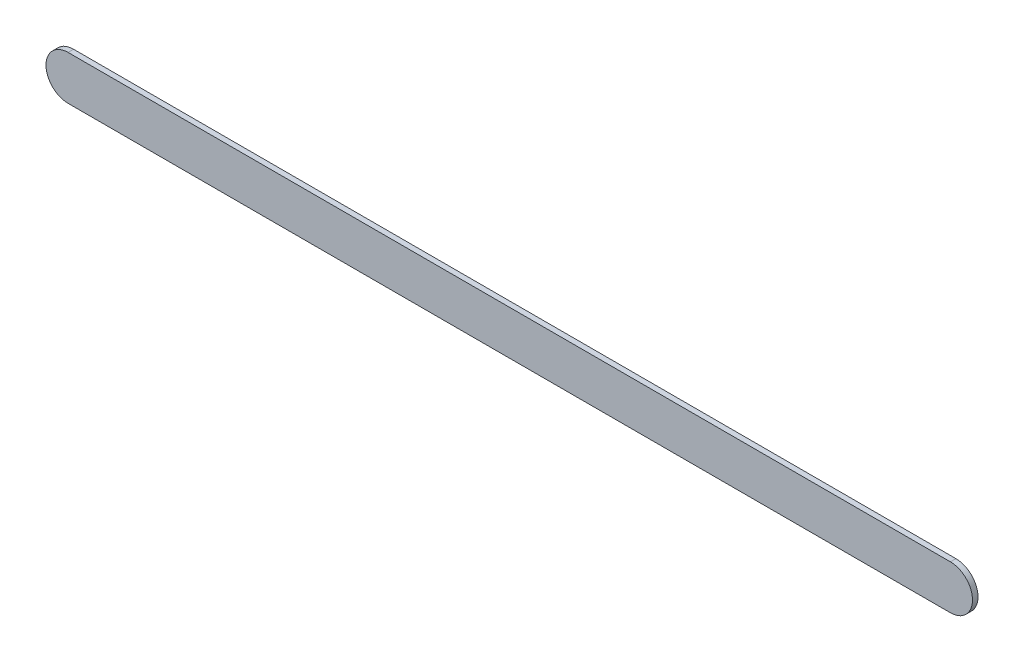
ISO-10303-21;
HEADER;
FILE_DESCRIPTION(('STEP AP214'),'2;1');
FILE_NAME('part.step','',(''),(''),'','','');
FILE_SCHEMA(('AUTOMOTIVE_DESIGN { 1 0 10303 214 1 1 1 1 }'));
ENDSEC;
DATA;
#1=APPLICATION_CONTEXT('core data for automotive mechanical design processes');
#2=APPLICATION_PROTOCOL_DEFINITION('international standard','automotive_design',2000,#1);
#3=PRODUCT_CONTEXT('',#1,'mechanical');
#4=PRODUCT('Part','Part','',(#3));
#5=PRODUCT_RELATED_PRODUCT_CATEGORY('part','',(#4));
#6=PRODUCT_DEFINITION_FORMATION('','',#4);
#7=PRODUCT_DEFINITION_CONTEXT('part definition',#1,'design');
#8=PRODUCT_DEFINITION('design','',#6,#7);
#9=PRODUCT_DEFINITION_SHAPE('','',#8);
#10=(LENGTH_UNIT() NAMED_UNIT(*) SI_UNIT(.MILLI.,.METRE.));
#11=(NAMED_UNIT(*) PLANE_ANGLE_UNIT() SI_UNIT($,.RADIAN.));
#12=(NAMED_UNIT(*) SI_UNIT($,.STERADIAN.) SOLID_ANGLE_UNIT());
#13=UNCERTAINTY_MEASURE_WITH_UNIT(LENGTH_MEASURE(1.E-05),#10,'distance_accuracy_value','');
#14=(GEOMETRIC_REPRESENTATION_CONTEXT(3) GLOBAL_UNCERTAINTY_ASSIGNED_CONTEXT((#13)) GLOBAL_UNIT_ASSIGNED_CONTEXT((#10,
#11,#12)) REPRESENTATION_CONTEXT('',''));
#15=CARTESIAN_POINT('',(0.,0.,0.));
#16=DIRECTION('',(0.,0.,1.));
#17=DIRECTION('',(1.,0.,0.));
#18=AXIS2_PLACEMENT_3D('',#15,#16,#17);
#19=CARTESIAN_POINT('',(508.,0.,3.175));
#20=DIRECTION('',(0.,0.,-1.));
#21=DIRECTION('',(-1.,0.,0.));
#22=AXIS2_PLACEMENT_3D('',#19,#20,#21);
#23=CYLINDRICAL_SURFACE('',#22,25.4);
#24=CARTESIAN_POINT('',(508.,0.,-3.175));
#25=DIRECTION('',(0.,0.,1.));
#26=DIRECTION('',(1.,0.,0.));
#27=AXIS2_PLACEMENT_3D('',#24,#25,#26);
#28=CIRCLE('',#27,25.4);
#29=CARTESIAN_POINT('',(508.,-25.4,-3.175));
#30=VERTEX_POINT('',#29);
#31=CARTESIAN_POINT('',(508.,25.4,-3.175));
#32=VERTEX_POINT('',#31);
#33=EDGE_CURVE('E98',#30,#32,#28,.T.);
#34=ORIENTED_EDGE('',*,*,#33,.T.);
#35=DIRECTION('',(0.,0.,-1.));
#36=VECTOR('',#35,1.);
#37=CARTESIAN_POINT('',(508.,25.4,3.175));
#38=LINE('',#37,#36);
#39=CARTESIAN_POINT('',(508.,25.4,3.175));
#40=VERTEX_POINT('',#39);
#41=EDGE_CURVE('E11',#40,#32,#38,.T.);
#42=ORIENTED_EDGE('',*,*,#41,.F.);
#43=CARTESIAN_POINT('',(508.,0.,3.175));
#44=DIRECTION('',(0.,0.,1.));
#45=DIRECTION('',(1.,0.,0.));
#46=AXIS2_PLACEMENT_3D('',#43,#44,#45);
#47=CIRCLE('',#46,25.4);
#48=CARTESIAN_POINT('',(508.,-25.4,3.175));
#49=VERTEX_POINT('',#48);
#50=EDGE_CURVE('E86',#49,#40,#47,.T.);
#51=ORIENTED_EDGE('',*,*,#50,.F.);
#52=DIRECTION('',(0.,0.,-1.));
#53=VECTOR('',#52,1.);
#54=CARTESIAN_POINT('',(508.,-25.4,3.175));
#55=LINE('',#54,#53);
#56=EDGE_CURVE('E94',#49,#30,#55,.T.);
#57=ORIENTED_EDGE('',*,*,#56,.T.);
#58=EDGE_LOOP('',(#34,#42,#51,#57));
#59=FACE_BOUND('',#58,.T.);
#60=ADVANCED_FACE('F35',(#59),#23,.T.);
#61=CARTESIAN_POINT('',(508.,25.4,3.175));
#62=DIRECTION('',(0.,-1.,0.));
#63=DIRECTION('',(1.,0.,0.));
#64=AXIS2_PLACEMENT_3D('',#61,#62,#63);
#65=PLANE('',#64);
#66=DIRECTION('',(-1.,0.,0.));
#67=VECTOR('',#66,1.);
#68=CARTESIAN_POINT('',(508.,25.4,-3.175));
#69=LINE('',#68,#67);
#70=CARTESIAN_POINT('',(-508.,25.3999999999999,-3.175));
#71=VERTEX_POINT('',#70);
#72=EDGE_CURVE('E90',#32,#71,#69,.T.);
#73=ORIENTED_EDGE('',*,*,#72,.T.);
#74=DIRECTION('',(0.,0.,-1.));
#75=VECTOR('',#74,1.);
#76=CARTESIAN_POINT('',(-508.,25.3999999999999,3.175));
#77=LINE('',#76,#75);
#78=CARTESIAN_POINT('',(-508.,25.3999999999999,3.175));
#79=VERTEX_POINT('',#78);
#80=EDGE_CURVE('E43',#79,#71,#77,.T.);
#81=ORIENTED_EDGE('',*,*,#80,.F.);
#82=DIRECTION('',(-1.,0.,0.));
#83=VECTOR('',#82,1.);
#84=CARTESIAN_POINT('',(508.,25.4,3.175));
#85=LINE('',#84,#83);
#86=EDGE_CURVE('E81',#40,#79,#85,.T.);
#87=ORIENTED_EDGE('',*,*,#86,.F.);
#88=ORIENTED_EDGE('',*,*,#41,.T.);
#89=EDGE_LOOP('',(#73,#81,#87,#88));
#90=FACE_BOUND('',#89,.T.);
#91=ADVANCED_FACE('F89',(#90),#65,.F.);
#92=CARTESIAN_POINT('',(-508.,0.,3.175));
#93=DIRECTION('',(0.,0.,-1.));
#94=DIRECTION('',(-1.,0.,0.));
#95=AXIS2_PLACEMENT_3D('',#92,#93,#94);
#96=CYLINDRICAL_SURFACE('',#95,25.4);
#97=CARTESIAN_POINT('',(-508.,0.,-3.175));
#98=DIRECTION('',(0.,0.,1.));
#99=DIRECTION('',(1.,0.,0.));
#100=AXIS2_PLACEMENT_3D('',#97,#98,#99);
#101=CIRCLE('',#100,25.4);
#102=CARTESIAN_POINT('',(-508.,-25.4000000000002,-3.175));
#103=VERTEX_POINT('',#102);
#104=EDGE_CURVE('E68',#71,#103,#101,.T.);
#105=ORIENTED_EDGE('',*,*,#104,.T.);
#106=DIRECTION('',(0.,0.,-1.));
#107=VECTOR('',#106,1.);
#108=CARTESIAN_POINT('',(-508.,-25.4000000000002,3.175));
#109=LINE('',#108,#107);
#110=CARTESIAN_POINT('',(-508.,-25.4000000000002,3.175));
#111=VERTEX_POINT('',#110);
#112=EDGE_CURVE('E91',#111,#103,#109,.T.);
#113=ORIENTED_EDGE('',*,*,#112,.F.);
#114=CARTESIAN_POINT('',(-508.,0.,3.175));
#115=DIRECTION('',(0.,0.,1.));
#116=DIRECTION('',(1.,0.,0.));
#117=AXIS2_PLACEMENT_3D('',#114,#115,#116);
#118=CIRCLE('',#117,25.4);
#119=EDGE_CURVE('E84',#79,#111,#118,.T.);
#120=ORIENTED_EDGE('',*,*,#119,.F.);
#121=ORIENTED_EDGE('',*,*,#80,.T.);
#122=EDGE_LOOP('',(#105,#113,#120,#121));
#123=FACE_BOUND('',#122,.T.);
#124=ADVANCED_FACE('F92',(#123),#96,.T.);
#125=CARTESIAN_POINT('',(508.,-25.4,3.175));
#126=DIRECTION('',(0.,1.,0.));
#127=DIRECTION('',(-1.,0.,0.));
#128=AXIS2_PLACEMENT_3D('',#125,#126,#127);
#129=PLANE('',#128);
#130=DIRECTION('',(1.,0.,0.));
#131=VECTOR('',#130,1.);
#132=CARTESIAN_POINT('',(508.,-25.4,-3.175));
#133=LINE('',#132,#131);
#134=EDGE_CURVE('E74',#103,#30,#133,.T.);
#135=ORIENTED_EDGE('',*,*,#134,.T.);
#136=ORIENTED_EDGE('',*,*,#56,.F.);
#137=DIRECTION('',(1.,0.,0.));
#138=VECTOR('',#137,1.);
#139=CARTESIAN_POINT('',(508.,-25.4,3.175));
#140=LINE('',#139,#138);
#141=EDGE_CURVE('E51',#111,#49,#140,.T.);
#142=ORIENTED_EDGE('',*,*,#141,.F.);
#143=ORIENTED_EDGE('',*,*,#112,.T.);
#144=EDGE_LOOP('',(#135,#136,#142,#143));
#145=FACE_BOUND('',#144,.T.);
#146=ADVANCED_FACE('F105',(#145),#129,.F.);
#147=CARTESIAN_POINT('',(508.,0.,3.175));
#148=DIRECTION('',(0.,0.,1.));
#149=DIRECTION('',(1.,0.,0.));
#150=AXIS2_PLACEMENT_3D('',#147,#148,#149);
#151=PLANE('',#150);
#152=ORIENTED_EDGE('',*,*,#50,.T.);
#153=ORIENTED_EDGE('',*,*,#86,.T.);
#154=ORIENTED_EDGE('',*,*,#119,.T.);
#155=ORIENTED_EDGE('',*,*,#141,.T.);
#156=EDGE_LOOP('',(#152,#153,#154,#155));
#157=FACE_BOUND('',#156,.T.);
#158=ADVANCED_FACE('F82',(#157),#151,.T.);
#159=CARTESIAN_POINT('',(508.,0.,-3.175));
#160=DIRECTION('',(0.,0.,1.));
#161=DIRECTION('',(1.,0.,0.));
#162=AXIS2_PLACEMENT_3D('',#159,#160,#161);
#163=PLANE('',#162);
#164=ORIENTED_EDGE('',*,*,#33,.F.);
#165=ORIENTED_EDGE('',*,*,#134,.F.);
#166=ORIENTED_EDGE('',*,*,#104,.F.);
#167=ORIENTED_EDGE('',*,*,#72,.F.);
#168=EDGE_LOOP('',(#164,#165,#166,#167));
#169=FACE_BOUND('',#168,.T.);
#170=ADVANCED_FACE('F108',(#169),#163,.F.);
#171=CLOSED_SHELL('',(#60,#91,#124,#146,#158,#170));
#172=MANIFOLD_SOLID_BREP('B2',#171);
#173=ADVANCED_BREP_SHAPE_REPRESENTATION('',(#18,#172),#14);
#174=SHAPE_DEFINITION_REPRESENTATION(#9,#173);
ENDSEC;
END-ISO-10303-21;
